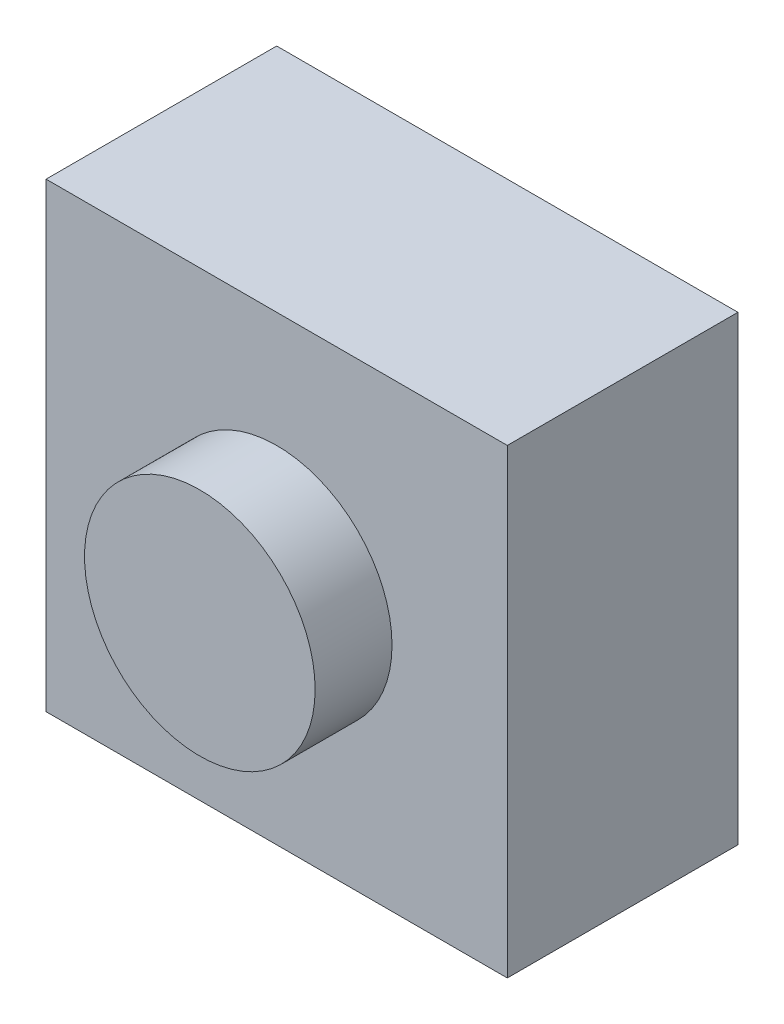
ISO-10303-21;
HEADER;
FILE_DESCRIPTION(('STEP AP214'),'2;1');
FILE_NAME('part.step','',(''),(''),'','','');
FILE_SCHEMA(('AUTOMOTIVE_DESIGN { 1 0 10303 214 1 1 1 1 }'));
ENDSEC;
DATA;
#1=APPLICATION_CONTEXT('core data for automotive mechanical design processes');
#2=APPLICATION_PROTOCOL_DEFINITION('international standard','automotive_design',2000,#1);
#3=PRODUCT_CONTEXT('',#1,'mechanical');
#4=PRODUCT('Part','Part','',(#3));
#5=PRODUCT_RELATED_PRODUCT_CATEGORY('part','',(#4));
#6=PRODUCT_DEFINITION_FORMATION('','',#4);
#7=PRODUCT_DEFINITION_CONTEXT('part definition',#1,'design');
#8=PRODUCT_DEFINITION('design','',#6,#7);
#9=PRODUCT_DEFINITION_SHAPE('','',#8);
#10=(LENGTH_UNIT() NAMED_UNIT(*) SI_UNIT(.MILLI.,.METRE.));
#11=(NAMED_UNIT(*) PLANE_ANGLE_UNIT() SI_UNIT($,.RADIAN.));
#12=(NAMED_UNIT(*) SI_UNIT($,.STERADIAN.) SOLID_ANGLE_UNIT());
#13=UNCERTAINTY_MEASURE_WITH_UNIT(LENGTH_MEASURE(1.E-05),#10,'distance_accuracy_value','');
#14=(GEOMETRIC_REPRESENTATION_CONTEXT(3) GLOBAL_UNCERTAINTY_ASSIGNED_CONTEXT((#13)) GLOBAL_UNIT_ASSIGNED_CONTEXT((#10,
#11,#12)) REPRESENTATION_CONTEXT('',''));
#15=CARTESIAN_POINT('',(0.,0.,0.));
#16=DIRECTION('',(0.,0.,1.));
#17=DIRECTION('',(1.,0.,0.));
#18=AXIS2_PLACEMENT_3D('',#15,#16,#17);
#19=CARTESIAN_POINT('',(0.,0.,0.));
#20=DIRECTION('',(0.,0.,1.));
#21=DIRECTION('',(1.,0.,0.));
#22=AXIS2_PLACEMENT_3D('',#19,#20,#21);
#23=PLANE('',#22);
#24=DIRECTION('',(0.,1.,0.));
#25=VECTOR('',#24,1.);
#26=CARTESIAN_POINT('',(-6.,0.,0.));
#27=LINE('',#26,#25);
#28=CARTESIAN_POINT('',(-6.,0.,0.));
#29=VERTEX_POINT('',#28);
#30=CARTESIAN_POINT('',(-6.,6.,0.));
#31=VERTEX_POINT('',#30);
#32=EDGE_CURVE('E156',#29,#31,#27,.T.);
#33=ORIENTED_EDGE('',*,*,#32,.T.);
#34=DIRECTION('',(-1.,0.,0.));
#35=VECTOR('',#34,1.);
#36=CARTESIAN_POINT('',(0.,6.,0.));
#37=LINE('',#36,#35);
#38=CARTESIAN_POINT('',(0.,6.,0.));
#39=VERTEX_POINT('',#38);
#40=EDGE_CURVE('E151',#39,#31,#37,.T.);
#41=ORIENTED_EDGE('',*,*,#40,.F.);
#42=DIRECTION('',(0.,1.,0.));
#43=VECTOR('',#42,1.);
#44=CARTESIAN_POINT('',(0.,0.,0.));
#45=LINE('',#44,#43);
#46=CARTESIAN_POINT('',(0.,0.,0.));
#47=VERTEX_POINT('',#46);
#48=EDGE_CURVE('E122',#47,#39,#45,.T.);
#49=ORIENTED_EDGE('',*,*,#48,.F.);
#50=DIRECTION('',(-1.,0.,0.));
#51=VECTOR('',#50,1.);
#52=CARTESIAN_POINT('',(0.,0.,0.));
#53=LINE('',#52,#51);
#54=EDGE_CURVE('E142',#47,#29,#53,.T.);
#55=ORIENTED_EDGE('',*,*,#54,.T.);
#56=EDGE_LOOP('',(#33,#41,#49,#55));
#57=FACE_BOUND('',#56,.T.);
#58=ADVANCED_FACE('F89',(#57),#23,.F.);
#59=CARTESIAN_POINT('',(0.,0.,3.));
#60=DIRECTION('',(0.,-1.,0.));
#61=DIRECTION('',(0.,0.,-1.));
#62=AXIS2_PLACEMENT_3D('',#59,#60,#61);
#63=PLANE('',#62);
#64=ORIENTED_EDGE('',*,*,#54,.F.);
#65=DIRECTION('',(0.,0.,-1.));
#66=VECTOR('',#65,1.);
#67=CARTESIAN_POINT('',(0.,0.,3.));
#68=LINE('',#67,#66);
#69=CARTESIAN_POINT('',(0.,0.,3.));
#70=VERTEX_POINT('',#69);
#71=EDGE_CURVE('E99',#70,#47,#68,.T.);
#72=ORIENTED_EDGE('',*,*,#71,.F.);
#73=DIRECTION('',(-1.,0.,0.));
#74=VECTOR('',#73,1.);
#75=CARTESIAN_POINT('',(0.,0.,3.));
#76=LINE('',#75,#74);
#77=CARTESIAN_POINT('',(-6.,0.,3.));
#78=VERTEX_POINT('',#77);
#79=EDGE_CURVE('E140',#70,#78,#76,.T.);
#80=ORIENTED_EDGE('',*,*,#79,.T.);
#81=DIRECTION('',(0.,0.,-1.));
#82=VECTOR('',#81,1.);
#83=CARTESIAN_POINT('',(-6.,0.,3.));
#84=LINE('',#83,#82);
#85=EDGE_CURVE('E12',#78,#29,#84,.T.);
#86=ORIENTED_EDGE('',*,*,#85,.T.);
#87=EDGE_LOOP('',(#64,#72,#80,#86));
#88=FACE_BOUND('',#87,.T.);
#89=ADVANCED_FACE('F138',(#88),#63,.T.);
#90=CARTESIAN_POINT('',(0.,0.,3.));
#91=DIRECTION('',(-1.,0.,0.));
#92=DIRECTION('',(0.,0.,1.));
#93=AXIS2_PLACEMENT_3D('',#90,#91,#92);
#94=PLANE('',#93);
#95=ORIENTED_EDGE('',*,*,#48,.T.);
#96=DIRECTION('',(0.,0.,-1.));
#97=VECTOR('',#96,1.);
#98=CARTESIAN_POINT('',(0.,6.,3.));
#99=LINE('',#98,#97);
#100=CARTESIAN_POINT('',(0.,6.,3.));
#101=VERTEX_POINT('',#100);
#102=EDGE_CURVE('E143',#101,#39,#99,.T.);
#103=ORIENTED_EDGE('',*,*,#102,.F.);
#104=DIRECTION('',(0.,1.,0.));
#105=VECTOR('',#104,1.);
#106=CARTESIAN_POINT('',(0.,0.,3.));
#107=LINE('',#106,#105);
#108=EDGE_CURVE('E145',#70,#101,#107,.T.);
#109=ORIENTED_EDGE('',*,*,#108,.F.);
#110=ORIENTED_EDGE('',*,*,#71,.T.);
#111=EDGE_LOOP('',(#95,#103,#109,#110));
#112=FACE_BOUND('',#111,.T.);
#113=ADVANCED_FACE('F146',(#112),#94,.F.);
#114=CARTESIAN_POINT('',(0.,6.,3.));
#115=DIRECTION('',(0.,-1.,0.));
#116=DIRECTION('',(1.,0.,0.));
#117=AXIS2_PLACEMENT_3D('',#114,#115,#116);
#118=PLANE('',#117);
#119=ORIENTED_EDGE('',*,*,#40,.T.);
#120=DIRECTION('',(0.,0.,-1.));
#121=VECTOR('',#120,1.);
#122=CARTESIAN_POINT('',(-6.,6.,3.));
#123=LINE('',#122,#121);
#124=CARTESIAN_POINT('',(-6.,6.,3.));
#125=VERTEX_POINT('',#124);
#126=EDGE_CURVE('E129',#125,#31,#123,.T.);
#127=ORIENTED_EDGE('',*,*,#126,.F.);
#128=DIRECTION('',(-1.,0.,0.));
#129=VECTOR('',#128,1.);
#130=CARTESIAN_POINT('',(0.,6.,3.));
#131=LINE('',#130,#129);
#132=EDGE_CURVE('E107',#101,#125,#131,.T.);
#133=ORIENTED_EDGE('',*,*,#132,.F.);
#134=ORIENTED_EDGE('',*,*,#102,.T.);
#135=EDGE_LOOP('',(#119,#127,#133,#134));
#136=FACE_BOUND('',#135,.T.);
#137=ADVANCED_FACE('F165',(#136),#118,.F.);
#138=CARTESIAN_POINT('',(-6.,0.,3.));
#139=DIRECTION('',(-1.,0.,0.));
#140=DIRECTION('',(0.,0.,1.));
#141=AXIS2_PLACEMENT_3D('',#138,#139,#140);
#142=PLANE('',#141);
#143=ORIENTED_EDGE('',*,*,#32,.F.);
#144=ORIENTED_EDGE('',*,*,#85,.F.);
#145=DIRECTION('',(0.,1.,0.));
#146=VECTOR('',#145,1.);
#147=CARTESIAN_POINT('',(-6.,0.,3.));
#148=LINE('',#147,#146);
#149=EDGE_CURVE('E149',#78,#125,#148,.T.);
#150=ORIENTED_EDGE('',*,*,#149,.T.);
#151=ORIENTED_EDGE('',*,*,#126,.T.);
#152=EDGE_LOOP('',(#143,#144,#150,#151));
#153=FACE_BOUND('',#152,.T.);
#154=ADVANCED_FACE('F91',(#153),#142,.T.);
#155=CARTESIAN_POINT('',(0.,0.,3.));
#156=DIRECTION('',(0.,0.,1.));
#157=DIRECTION('',(1.,0.,0.));
#158=AXIS2_PLACEMENT_3D('',#155,#156,#157);
#159=PLANE('',#158);
#160=CARTESIAN_POINT('',(-3.,3.,3.));
#161=DIRECTION('',(0.,0.,1.));
#162=DIRECTION('',(1.,0.,0.));
#163=AXIS2_PLACEMENT_3D('',#160,#161,#162);
#164=CIRCLE('',#163,1.5);
#165=CARTESIAN_POINT('',(-1.5,3.,3.));
#166=VERTEX_POINT('',#165);
#167=EDGE_CURVE('E93',#166,#166,#164,.F.);
#168=ORIENTED_EDGE('',*,*,#167,.T.);
#169=EDGE_LOOP('',(#168));
#170=FACE_BOUND('',#169,.T.);
#171=ORIENTED_EDGE('',*,*,#149,.F.);
#172=ORIENTED_EDGE('',*,*,#79,.F.);
#173=ORIENTED_EDGE('',*,*,#108,.T.);
#174=ORIENTED_EDGE('',*,*,#132,.T.);
#175=EDGE_LOOP('',(#171,#172,#173,#174));
#176=FACE_BOUND('',#175,.T.);
#177=ADVANCED_FACE('F148',(#170,#176),#159,.T.);
#178=CARTESIAN_POINT('',(-3.,3.,4.));
#179=DIRECTION('',(0.,0.,-1.));
#180=DIRECTION('',(-1.,0.,0.));
#181=AXIS2_PLACEMENT_3D('',#178,#179,#180);
#182=CYLINDRICAL_SURFACE('',#181,1.5);
#183=ORIENTED_EDGE('',*,*,#167,.F.);
#184=EDGE_LOOP('',(#183));
#185=FACE_BOUND('',#184,.T.);
#186=CARTESIAN_POINT('',(-3.,3.,4.));
#187=DIRECTION('',(0.,0.,1.));
#188=DIRECTION('',(1.,0.,0.));
#189=AXIS2_PLACEMENT_3D('',#186,#187,#188);
#190=CIRCLE('',#189,1.5);
#191=CARTESIAN_POINT('',(-1.5,3.,4.));
#192=VERTEX_POINT('',#191);
#193=EDGE_CURVE('E251',#192,#192,#190,.T.);
#194=ORIENTED_EDGE('',*,*,#193,.F.);
#195=EDGE_LOOP('',(#194));
#196=FACE_BOUND('',#195,.T.);
#197=ADVANCED_FACE('F168',(#185,#196),#182,.T.);
#198=CARTESIAN_POINT('',(0.,0.,4.));
#199=DIRECTION('',(0.,0.,1.));
#200=DIRECTION('',(1.,0.,0.));
#201=AXIS2_PLACEMENT_3D('',#198,#199,#200);
#202=PLANE('',#201);
#203=ORIENTED_EDGE('',*,*,#193,.T.);
#204=EDGE_LOOP('',(#203));
#205=FACE_BOUND('',#204,.T.);
#206=ADVANCED_FACE('F177',(#205),#202,.T.);
#207=CLOSED_SHELL('',(#58,#89,#113,#137,#154,#177,#197,#206));
#208=MANIFOLD_SOLID_BREP('B2',#207);
#209=ADVANCED_BREP_SHAPE_REPRESENTATION('',(#18,#208),#14);
#210=SHAPE_DEFINITION_REPRESENTATION(#9,#209);
ENDSEC;
END-ISO-10303-21;
